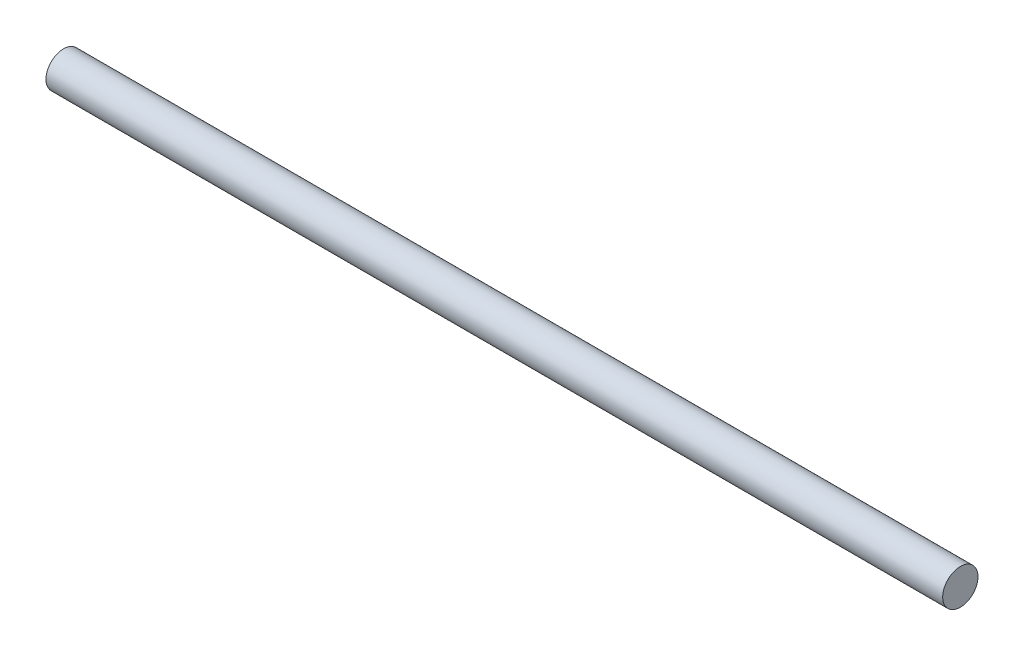
ISO-10303-21;
HEADER;
FILE_DESCRIPTION(('STEP AP214'),'2;1');
FILE_NAME('part.step','',(''),(''),'','','');
FILE_SCHEMA(('AUTOMOTIVE_DESIGN { 1 0 10303 214 1 1 1 1 }'));
ENDSEC;
DATA;
#1=APPLICATION_CONTEXT('core data for automotive mechanical design processes');
#2=APPLICATION_PROTOCOL_DEFINITION('international standard','automotive_design',2000,#1);
#3=PRODUCT_CONTEXT('',#1,'mechanical');
#4=PRODUCT('Part','Part','',(#3));
#5=PRODUCT_RELATED_PRODUCT_CATEGORY('part','',(#4));
#6=PRODUCT_DEFINITION_FORMATION('','',#4);
#7=PRODUCT_DEFINITION_CONTEXT('part definition',#1,'design');
#8=PRODUCT_DEFINITION('design','',#6,#7);
#9=PRODUCT_DEFINITION_SHAPE('','',#8);
#10=(LENGTH_UNIT() NAMED_UNIT(*) SI_UNIT(.MILLI.,.METRE.));
#11=(NAMED_UNIT(*) PLANE_ANGLE_UNIT() SI_UNIT($,.RADIAN.));
#12=(NAMED_UNIT(*) SI_UNIT($,.STERADIAN.) SOLID_ANGLE_UNIT());
#13=UNCERTAINTY_MEASURE_WITH_UNIT(LENGTH_MEASURE(1.E-05),#10,'distance_accuracy_value','');
#14=(GEOMETRIC_REPRESENTATION_CONTEXT(3) GLOBAL_UNCERTAINTY_ASSIGNED_CONTEXT((#13)) GLOBAL_UNIT_ASSIGNED_CONTEXT((#10,
#11,#12)) REPRESENTATION_CONTEXT('',''));
#15=CARTESIAN_POINT('',(0.,0.,0.));
#16=DIRECTION('',(0.,0.,1.));
#17=DIRECTION('',(1.,0.,0.));
#18=AXIS2_PLACEMENT_3D('',#15,#16,#17);
#19=CARTESIAN_POINT('',(304.54,-26.2949096592635,30.0418470628088));
#20=DIRECTION('',(-1.,0.,0.));
#21=DIRECTION('',(0.,0.,1.));
#22=AXIS2_PLACEMENT_3D('',#19,#20,#21);
#23=CYLINDRICAL_SURFACE('',#22,6.);
#24=CARTESIAN_POINT('',(304.54,-26.2949096592635,30.0418470628088));
#25=DIRECTION('',(1.,0.,0.));
#26=DIRECTION('',(0.,0.,-1.));
#27=AXIS2_PLACEMENT_3D('',#24,#25,#26);
#28=CIRCLE('',#27,6.);
#29=CARTESIAN_POINT('',(304.54,-26.2949096592635,24.0418470628088));
#30=VERTEX_POINT('',#29);
#31=EDGE_CURVE('E10',#30,#30,#28,.T.);
#32=ORIENTED_EDGE('',*,*,#31,.F.);
#33=EDGE_LOOP('',(#32));
#34=FACE_BOUND('',#33,.T.);
#35=CARTESIAN_POINT('',(0.,-26.2949096592635,30.0418470628088));
#36=DIRECTION('',(1.,0.,0.));
#37=DIRECTION('',(0.,0.,-1.));
#38=AXIS2_PLACEMENT_3D('',#35,#36,#37);
#39=CIRCLE('',#38,6.);
#40=CARTESIAN_POINT('',(0.,-26.2949096592635,24.0418470628088));
#41=VERTEX_POINT('',#40);
#42=EDGE_CURVE('E40',#41,#41,#39,.T.);
#43=ORIENTED_EDGE('',*,*,#42,.T.);
#44=EDGE_LOOP('',(#43));
#45=FACE_BOUND('',#44,.T.);
#46=ADVANCED_FACE('F37',(#34,#45),#23,.T.);
#47=CARTESIAN_POINT('',(304.54,-26.2949096592635,30.0418470628088));
#48=DIRECTION('',(1.,0.,0.));
#49=DIRECTION('',(0.,0.,-1.));
#50=AXIS2_PLACEMENT_3D('',#47,#48,#49);
#51=PLANE('',#50);
#52=ORIENTED_EDGE('',*,*,#31,.T.);
#53=EDGE_LOOP('',(#52));
#54=FACE_BOUND('',#53,.T.);
#55=ADVANCED_FACE('F52',(#54),#51,.T.);
#56=CARTESIAN_POINT('',(0.,-26.2949096592635,30.0418470628088));
#57=DIRECTION('',(1.,0.,0.));
#58=DIRECTION('',(0.,0.,-1.));
#59=AXIS2_PLACEMENT_3D('',#56,#57,#58);
#60=PLANE('',#59);
#61=ORIENTED_EDGE('',*,*,#42,.F.);
#62=EDGE_LOOP('',(#61));
#63=FACE_BOUND('',#62,.T.);
#64=ADVANCED_FACE('F50',(#63),#60,.F.);
#65=CLOSED_SHELL('',(#46,#55,#64));
#66=MANIFOLD_SOLID_BREP('B2',#65);
#67=ADVANCED_BREP_SHAPE_REPRESENTATION('',(#18,#66),#14);
#68=SHAPE_DEFINITION_REPRESENTATION(#9,#67);
ENDSEC;
END-ISO-10303-21;
